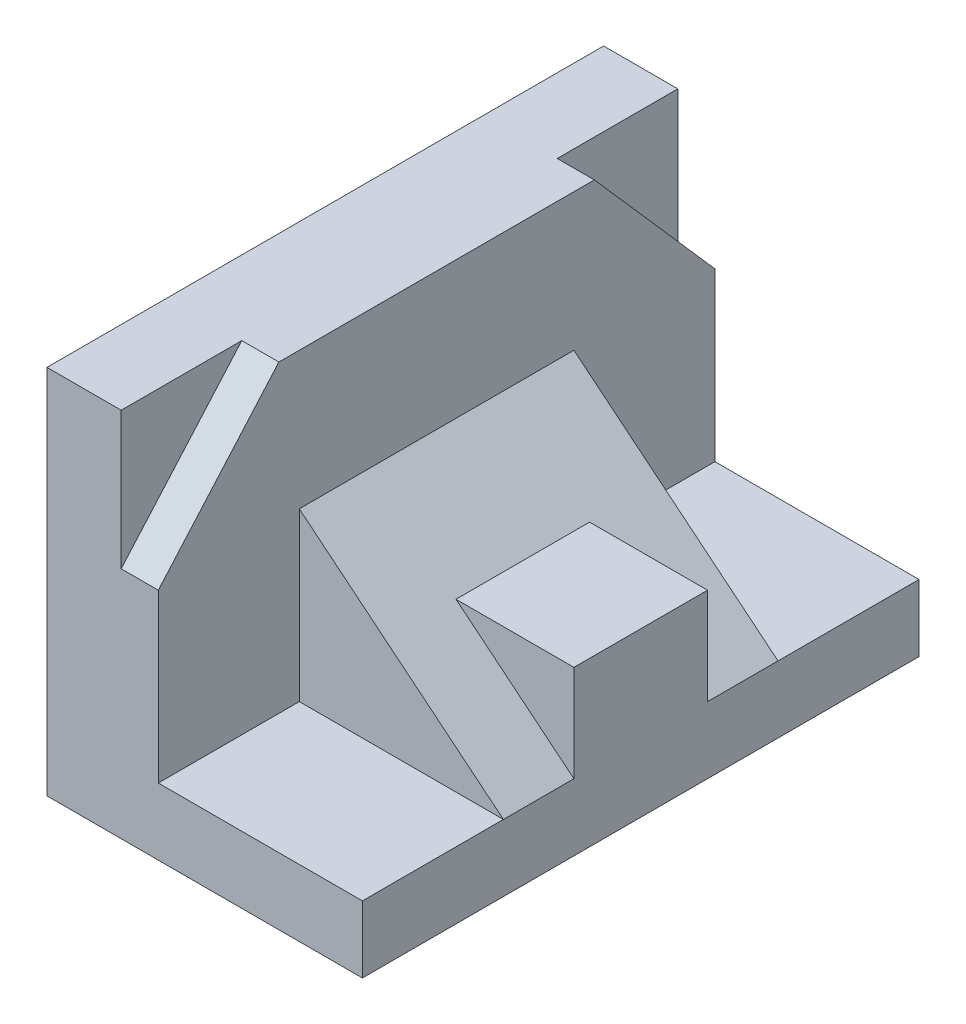
ISO-10303-21;
HEADER;
FILE_DESCRIPTION(('STEP AP214'),'2;1');
FILE_NAME('part.step','',(''),(''),'','','');
FILE_SCHEMA(('AUTOMOTIVE_DESIGN { 1 0 10303 214 1 1 1 1 }'));
ENDSEC;
DATA;
#1=APPLICATION_CONTEXT('core data for automotive mechanical design processes');
#2=APPLICATION_PROTOCOL_DEFINITION('international standard','automotive_design',2000,#1);
#3=PRODUCT_CONTEXT('',#1,'mechanical');
#4=PRODUCT('Part','Part','',(#3));
#5=PRODUCT_RELATED_PRODUCT_CATEGORY('part','',(#4));
#6=PRODUCT_DEFINITION_FORMATION('','',#4);
#7=PRODUCT_DEFINITION_CONTEXT('part definition',#1,'design');
#8=PRODUCT_DEFINITION('design','',#6,#7);
#9=PRODUCT_DEFINITION_SHAPE('','',#8);
#10=(LENGTH_UNIT() NAMED_UNIT(*) SI_UNIT(.MILLI.,.METRE.));
#11=(NAMED_UNIT(*) PLANE_ANGLE_UNIT() SI_UNIT($,.RADIAN.));
#12=(NAMED_UNIT(*) SI_UNIT($,.STERADIAN.) SOLID_ANGLE_UNIT());
#13=UNCERTAINTY_MEASURE_WITH_UNIT(LENGTH_MEASURE(1.E-05),#10,'distance_accuracy_value','');
#14=(GEOMETRIC_REPRESENTATION_CONTEXT(3) GLOBAL_UNCERTAINTY_ASSIGNED_CONTEXT((#13)) GLOBAL_UNIT_ASSIGNED_CONTEXT((#10,
#11,#12)) REPRESENTATION_CONTEXT('',''));
#15=CARTESIAN_POINT('',(0.,0.,0.));
#16=DIRECTION('',(0.,0.,1.));
#17=DIRECTION('',(1.,0.,0.));
#18=AXIS2_PLACEMENT_3D('',#15,#16,#17);
#19=CARTESIAN_POINT('',(-19.0655605518411,0.,0.));
#20=DIRECTION('',(1.,0.,0.));
#21=DIRECTION('',(0.,0.,-1.));
#22=AXIS2_PLACEMENT_3D('',#19,#20,#21);
#23=PLANE('',#22);
#24=DIRECTION('',(0.,-1.,0.));
#25=VECTOR('',#24,1.);
#26=CARTESIAN_POINT('',(-19.065560551841,100.,29.6907665505226));
#27=LINE('',#26,#25);
#28=CARTESIAN_POINT('',(-19.065560551841,100.,29.6907665505226));
#29=VERTEX_POINT('',#28);
#30=CARTESIAN_POINT('',(-19.065560551841,63.,29.6907665505226));
#31=VERTEX_POINT('',#30);
#32=EDGE_CURVE('E173',#29,#31,#27,.T.);
#33=ORIENTED_EDGE('',*,*,#32,.T.);
#34=DIRECTION('',(0.,-0.751317435494103,0.659940990636712));
#35=VECTOR('',#34,1.);
#36=CARTESIAN_POINT('',(-19.0655605518411,100.,-2.80923344947735));
#37=LINE('',#36,#35);
#38=CARTESIAN_POINT('',(-19.0655605518411,100.,-2.80923344947735));
#39=VERTEX_POINT('',#38);
#40=EDGE_CURVE('E186',#39,#31,#37,.T.);
#41=ORIENTED_EDGE('',*,*,#40,.F.);
#42=DIRECTION('',(0.,0.,1.));
#43=VECTOR('',#42,1.);
#44=CARTESIAN_POINT('',(-19.065560551841,100.,29.6907665505226));
#45=LINE('',#44,#43);
#46=EDGE_CURVE('E196',#39,#29,#45,.T.);
#47=ORIENTED_EDGE('',*,*,#46,.T.);
#48=EDGE_LOOP('',(#33,#41,#47));
#49=FACE_BOUND('',#48,.T.);
#50=ADVANCED_FACE('F41',(#49),#23,.T.);
#51=CARTESIAN_POINT('',(-19.0655605518411,100.,-120.309233449477));
#52=VERTEX_POINT('',#51);
#53=CARTESIAN_POINT('',(-19.0655605518411,100.,-87.8092334494774));
#54=VERTEX_POINT('',#53);
#55=EDGE_CURVE('E57',#52,#54,#45,.T.);
#56=ORIENTED_EDGE('',*,*,#55,.T.);
#57=DIRECTION('',(0.,0.751317435494103,0.659940990636712));
#58=VECTOR('',#57,1.);
#59=CARTESIAN_POINT('',(-19.0655605518411,100.,-87.8092334494774));
#60=LINE('',#59,#58);
#61=CARTESIAN_POINT('',(-19.0655605518411,63.,-120.309233449477));
#62=VERTEX_POINT('',#61);
#63=EDGE_CURVE('E170',#62,#54,#60,.T.);
#64=ORIENTED_EDGE('',*,*,#63,.F.);
#65=DIRECTION('',(0.,1.,0.));
#66=VECTOR('',#65,1.);
#67=CARTESIAN_POINT('',(-19.0655605518411,100.,-120.309233449477));
#68=LINE('',#67,#66);
#69=EDGE_CURVE('E61',#62,#52,#68,.T.);
#70=ORIENTED_EDGE('',*,*,#69,.T.);
#71=EDGE_LOOP('',(#56,#64,#70));
#72=FACE_BOUND('',#71,.T.);
#73=ADVANCED_FACE('F383',(#72),#23,.T.);
#74=CARTESIAN_POINT('',(0.,100.,0.));
#75=DIRECTION('',(0.,1.,0.));
#76=DIRECTION('',(0.,0.,1.));
#77=AXIS2_PLACEMENT_3D('',#74,#75,#76);
#78=PLANE('',#77);
#79=DIRECTION('',(1.,0.,0.));
#80=VECTOR('',#79,1.);
#81=CARTESIAN_POINT('',(-39.0655605518411,100.,29.6907665505226));
#82=LINE('',#81,#80);
#83=CARTESIAN_POINT('',(-39.0655605518411,100.,29.6907665505226));
#84=VERTEX_POINT('',#83);
#85=EDGE_CURVE('E259',#84,#29,#82,.T.);
#86=ORIENTED_EDGE('',*,*,#85,.T.);
#87=ORIENTED_EDGE('',*,*,#46,.F.);
#88=DIRECTION('',(-1.,0.,0.));
#89=VECTOR('',#88,1.);
#90=CARTESIAN_POINT('',(-9.06556055184105,100.,-2.80923344947735));
#91=LINE('',#90,#89);
#92=CARTESIAN_POINT('',(-9.06556055184105,100.,-2.80923344947735));
#93=VERTEX_POINT('',#92);
#94=EDGE_CURVE('E174',#93,#39,#91,.T.);
#95=ORIENTED_EDGE('',*,*,#94,.F.);
#96=DIRECTION('',(0.,0.,1.));
#97=VECTOR('',#96,1.);
#98=CARTESIAN_POINT('',(-9.06556055184105,100.,-2.80923344947735));
#99=LINE('',#98,#97);
#100=CARTESIAN_POINT('',(-9.06556055184108,100.,-87.8092334494774));
#101=VERTEX_POINT('',#100);
#102=EDGE_CURVE('E158',#101,#93,#99,.T.);
#103=ORIENTED_EDGE('',*,*,#102,.F.);
#104=DIRECTION('',(-1.,0.,0.));
#105=VECTOR('',#104,1.);
#106=CARTESIAN_POINT('',(-9.06556055184108,100.,-87.8092334494774));
#107=LINE('',#106,#105);
#108=EDGE_CURVE('E168',#101,#54,#107,.T.);
#109=ORIENTED_EDGE('',*,*,#108,.T.);
#110=ORIENTED_EDGE('',*,*,#55,.F.);
#111=DIRECTION('',(-1.,0.,0.));
#112=VECTOR('',#111,1.);
#113=CARTESIAN_POINT('',(-39.0655605518411,100.,-120.309233449477));
#114=LINE('',#113,#112);
#115=CARTESIAN_POINT('',(-39.0655605518411,100.,-120.309233449477));
#116=VERTEX_POINT('',#115);
#117=EDGE_CURVE('E267',#52,#116,#114,.T.);
#118=ORIENTED_EDGE('',*,*,#117,.T.);
#119=DIRECTION('',(0.,0.,1.));
#120=VECTOR('',#119,1.);
#121=CARTESIAN_POINT('',(-39.0655605518411,100.,-120.309233449477));
#122=LINE('',#121,#120);
#123=EDGE_CURVE('E263',#116,#84,#122,.T.);
#124=ORIENTED_EDGE('',*,*,#123,.T.);
#125=EDGE_LOOP('',(#86,#87,#95,#103,#109,#110,#118,#124));
#126=FACE_BOUND('',#125,.T.);
#127=ADVANCED_FACE('F177',(#126),#78,.T.);
#128=CARTESIAN_POINT('',(45.934439448159,18.,-82.3092334494773));
#129=DIRECTION('',(-0.633237790257262,-0.773957299203321,0.));
#130=DIRECTION('',(0.773957299203321,-0.633237790257263,0.));
#131=AXIS2_PLACEMENT_3D('',#128,#129,#130);
#132=PLANE('',#131);
#133=DIRECTION('',(0.773957299203321,-0.633237790257263,0.));
#134=VECTOR('',#133,1.);
#135=CARTESIAN_POINT('',(45.934439448159,18.,-27.3092334494773));
#136=LINE('',#135,#134);
#137=CARTESIAN_POINT('',(14.1566616703812,44.,-27.3092334494773));
#138=VERTEX_POINT('',#137);
#139=CARTESIAN_POINT('',(45.934439448159,18.,-27.3092334494773));
#140=VERTEX_POINT('',#139);
#141=EDGE_CURVE('E12',#138,#140,#136,.T.);
#142=ORIENTED_EDGE('',*,*,#141,.F.);
#143=DIRECTION('',(0.,0.,-1.));
#144=VECTOR('',#143,1.);
#145=CARTESIAN_POINT('',(14.1566616703812,44.,-82.3092334494773));
#146=LINE('',#145,#144);
#147=CARTESIAN_POINT('',(14.1566616703812,44.,-63.3092334494773));
#148=VERTEX_POINT('',#147);
#149=EDGE_CURVE('E314',#138,#148,#146,.T.);
#150=ORIENTED_EDGE('',*,*,#149,.T.);
#151=DIRECTION('',(-0.773957299203321,0.633237790257263,0.));
#152=VECTOR('',#151,1.);
#153=CARTESIAN_POINT('',(45.934439448159,18.,-63.3092334494773));
#154=LINE('',#153,#152);
#155=CARTESIAN_POINT('',(45.934439448159,18.,-63.3092334494773));
#156=VERTEX_POINT('',#155);
#157=EDGE_CURVE('E50',#156,#148,#154,.T.);
#158=ORIENTED_EDGE('',*,*,#157,.F.);
#159=DIRECTION('',(0.,0.,1.));
#160=VECTOR('',#159,1.);
#161=CARTESIAN_POINT('',(45.934439448159,18.,-82.3092334494773));
#162=LINE('',#161,#160);
#163=CARTESIAN_POINT('',(45.934439448159,18.,-82.3092334494773));
#164=VERTEX_POINT('',#163);
#165=EDGE_CURVE('E232',#164,#156,#162,.T.);
#166=ORIENTED_EDGE('',*,*,#165,.F.);
#167=DIRECTION('',(0.773957299203321,-0.633237790257262,0.));
#168=VECTOR('',#167,1.);
#169=CARTESIAN_POINT('',(45.934439448159,18.,-82.3092334494773));
#170=LINE('',#169,#168);
#171=CARTESIAN_POINT('',(-9.06556055184108,63.,-82.3092334494773));
#172=VERTEX_POINT('',#171);
#173=EDGE_CURVE('E224',#172,#164,#170,.T.);
#174=ORIENTED_EDGE('',*,*,#173,.F.);
#175=DIRECTION('',(0.,0.,1.));
#176=VECTOR('',#175,1.);
#177=CARTESIAN_POINT('',(-9.06556055184108,63.,-82.3092334494773));
#178=LINE('',#177,#176);
#179=CARTESIAN_POINT('',(-9.06556055184105,63.,-8.30923344947734));
#180=VERTEX_POINT('',#179);
#181=EDGE_CURVE('E237',#172,#180,#178,.T.);
#182=ORIENTED_EDGE('',*,*,#181,.T.);
#183=DIRECTION('',(0.773957299203321,-0.633237790257262,0.));
#184=VECTOR('',#183,1.);
#185=CARTESIAN_POINT('',(45.934439448159,18.,-8.30923344947734));
#186=LINE('',#185,#184);
#187=CARTESIAN_POINT('',(45.934439448159,18.,-8.30923344947734));
#188=VERTEX_POINT('',#187);
#189=EDGE_CURVE('E211',#180,#188,#186,.T.);
#190=ORIENTED_EDGE('',*,*,#189,.T.);
#191=EDGE_CURVE('E228',#140,#188,#162,.T.);
#192=ORIENTED_EDGE('',*,*,#191,.F.);
#193=EDGE_LOOP('',(#142,#150,#158,#166,#174,#182,#190,#192));
#194=FACE_BOUND('',#193,.T.);
#195=ADVANCED_FACE('F325',(#194),#132,.F.);
#196=CARTESIAN_POINT('',(0.,18.,0.));
#197=DIRECTION('',(0.,1.,0.));
#198=DIRECTION('',(0.,0.,1.));
#199=AXIS2_PLACEMENT_3D('',#196,#197,#198);
#200=PLANE('',#199);
#201=DIRECTION('',(0.,0.,-1.));
#202=VECTOR('',#201,1.);
#203=CARTESIAN_POINT('',(45.9344394481589,18.,-120.309233449477));
#204=LINE('',#203,#202);
#205=CARTESIAN_POINT('',(45.934439448159,18.,29.6907665505227));
#206=VERTEX_POINT('',#205);
#207=EDGE_CURVE('E279',#206,#188,#204,.T.);
#208=ORIENTED_EDGE('',*,*,#207,.T.);
#209=DIRECTION('',(1.,0.,0.));
#210=VECTOR('',#209,1.);
#211=CARTESIAN_POINT('',(-9.06556055184106,18.,-8.30923344947734));
#212=LINE('',#211,#210);
#213=CARTESIAN_POINT('',(-9.06556055184106,18.,-8.30923344947734));
#214=VERTEX_POINT('',#213);
#215=EDGE_CURVE('E236',#214,#188,#212,.T.);
#216=ORIENTED_EDGE('',*,*,#215,.F.);
#217=DIRECTION('',(0.,0.,-1.));
#218=VECTOR('',#217,1.);
#219=CARTESIAN_POINT('',(-9.06556055184109,18.,-120.309233449477));
#220=LINE('',#219,#218);
#221=CARTESIAN_POINT('',(-9.06556055184107,18.,29.6907665505227));
#222=VERTEX_POINT('',#221);
#223=EDGE_CURVE('E254',#222,#214,#220,.T.);
#224=ORIENTED_EDGE('',*,*,#223,.F.);
#225=DIRECTION('',(1.,0.,0.));
#226=VECTOR('',#225,1.);
#227=CARTESIAN_POINT('',(-39.065560551841,18.,29.6907665505227));
#228=LINE('',#227,#226);
#229=EDGE_CURVE('E274',#222,#206,#228,.T.);
#230=ORIENTED_EDGE('',*,*,#229,.T.);
#231=EDGE_LOOP('',(#208,#216,#224,#230));
#232=FACE_BOUND('',#231,.T.);
#233=ADVANCED_FACE('F372',(#232),#200,.T.);
#234=CARTESIAN_POINT('',(-9.06556055184108,18.,-82.3092334494773));
#235=VERTEX_POINT('',#234);
#236=CARTESIAN_POINT('',(-9.06556055184109,18.,-120.309233449477));
#237=VERTEX_POINT('',#236);
#238=EDGE_CURVE('E258',#235,#237,#220,.T.);
#239=ORIENTED_EDGE('',*,*,#238,.F.);
#240=DIRECTION('',(-1.,0.,0.));
#241=VECTOR('',#240,1.);
#242=CARTESIAN_POINT('',(-9.06556055184108,18.,-82.3092334494773));
#243=LINE('',#242,#241);
#244=EDGE_CURVE('E241',#164,#235,#243,.T.);
#245=ORIENTED_EDGE('',*,*,#244,.F.);
#246=CARTESIAN_POINT('',(45.9344394481589,18.,-120.309233449477));
#247=VERTEX_POINT('',#246);
#248=EDGE_CURVE('E277',#164,#247,#204,.T.);
#249=ORIENTED_EDGE('',*,*,#248,.T.);
#250=DIRECTION('',(-1.,0.,0.));
#251=VECTOR('',#250,1.);
#252=CARTESIAN_POINT('',(-39.0655605518411,18.,-120.309233449477));
#253=LINE('',#252,#251);
#254=EDGE_CURVE('E283',#247,#237,#253,.T.);
#255=ORIENTED_EDGE('',*,*,#254,.T.);
#256=EDGE_LOOP('',(#239,#245,#249,#255));
#257=FACE_BOUND('',#256,.T.);
#258=ADVANCED_FACE('F370',(#257),#200,.T.);
#259=CARTESIAN_POINT('',(-9.06556055184109,352.970585407784,-120.309233449477));
#260=DIRECTION('',(-1.,0.,0.));
#261=DIRECTION('',(0.,0.,1.));
#262=AXIS2_PLACEMENT_3D('',#259,#260,#261);
#263=PLANE('',#262);
#264=DIRECTION('',(0.,-1.,0.));
#265=VECTOR('',#264,1.);
#266=CARTESIAN_POINT('',(-9.06556055184106,63.,-8.30923344947734));
#267=LINE('',#266,#265);
#268=EDGE_CURVE('E250',#180,#214,#267,.T.);
#269=ORIENTED_EDGE('',*,*,#268,.F.);
#270=ORIENTED_EDGE('',*,*,#181,.F.);
#271=DIRECTION('',(0.,-1.,0.));
#272=VECTOR('',#271,1.);
#273=CARTESIAN_POINT('',(-9.06556055184108,63.,-82.3092334494773));
#274=LINE('',#273,#272);
#275=EDGE_CURVE('E240',#172,#235,#274,.T.);
#276=ORIENTED_EDGE('',*,*,#275,.T.);
#277=ORIENTED_EDGE('',*,*,#238,.T.);
#278=DIRECTION('',(0.,-1.,0.));
#279=VECTOR('',#278,1.);
#280=CARTESIAN_POINT('',(-9.06556055184109,352.970585407784,-120.309233449477));
#281=LINE('',#280,#279);
#282=CARTESIAN_POINT('',(-9.06556055184109,63.,-120.309233449477));
#283=VERTEX_POINT('',#282);
#284=EDGE_CURVE('E161',#283,#237,#281,.T.);
#285=ORIENTED_EDGE('',*,*,#284,.F.);
#286=DIRECTION('',(0.,0.751317435494103,0.659940990636712));
#287=VECTOR('',#286,1.);
#288=CARTESIAN_POINT('',(-9.06556055184108,100.,-87.8092334494774));
#289=LINE('',#288,#287);
#290=EDGE_CURVE('E152',#283,#101,#289,.T.);
#291=ORIENTED_EDGE('',*,*,#290,.T.);
#292=ORIENTED_EDGE('',*,*,#102,.T.);
#293=DIRECTION('',(0.,-0.751317435494103,0.659940990636712));
#294=VECTOR('',#293,1.);
#295=CARTESIAN_POINT('',(-9.06556055184105,100.,-2.80923344947735));
#296=LINE('',#295,#294);
#297=CARTESIAN_POINT('',(-9.06556055184104,63.,29.6907665505226));
#298=VERTEX_POINT('',#297);
#299=EDGE_CURVE('E165',#93,#298,#296,.T.);
#300=ORIENTED_EDGE('',*,*,#299,.T.);
#301=DIRECTION('',(0.,-1.,0.));
#302=VECTOR('',#301,1.);
#303=CARTESIAN_POINT('',(-9.06556055184104,352.970585407784,29.6907665505226));
#304=LINE('',#303,#302);
#305=EDGE_CURVE('E253',#298,#222,#304,.T.);
#306=ORIENTED_EDGE('',*,*,#305,.T.);
#307=ORIENTED_EDGE('',*,*,#223,.T.);
#308=EDGE_LOOP('',(#269,#270,#276,#277,#285,#291,#292,#300,#306,#307));
#309=FACE_BOUND('',#308,.T.);
#310=ADVANCED_FACE('F155',(#309),#263,.F.);
#311=CARTESIAN_POINT('',(-39.0655605518411,18.,-120.309233449477));
#312=DIRECTION('',(1.,0.,0.));
#313=DIRECTION('',(0.,0.,-1.));
#314=AXIS2_PLACEMENT_3D('',#311,#312,#313);
#315=PLANE('',#314);
#316=DIRECTION('',(0.,0.,1.));
#317=VECTOR('',#316,1.);
#318=CARTESIAN_POINT('',(-39.0655605518411,0.,-120.309233449477));
#319=LINE('',#318,#317);
#320=CARTESIAN_POINT('',(-39.0655605518411,0.,-120.309233449477));
#321=VERTEX_POINT('',#320);
#322=CARTESIAN_POINT('',(-39.065560551841,0.,29.6907665505227));
#323=VERTEX_POINT('',#322);
#324=EDGE_CURVE('E262',#321,#323,#319,.T.);
#325=ORIENTED_EDGE('',*,*,#324,.T.);
#326=DIRECTION('',(0.,-1.,0.));
#327=VECTOR('',#326,1.);
#328=CARTESIAN_POINT('',(-39.065560551841,18.,29.6907665505227));
#329=LINE('',#328,#327);
#330=EDGE_CURVE('E310',#84,#323,#329,.T.);
#331=ORIENTED_EDGE('',*,*,#330,.F.);
#332=ORIENTED_EDGE('',*,*,#123,.F.);
#333=DIRECTION('',(0.,-1.,0.));
#334=VECTOR('',#333,1.);
#335=CARTESIAN_POINT('',(-39.0655605518411,18.,-120.309233449477));
#336=LINE('',#335,#334);
#337=EDGE_CURVE('E287',#116,#321,#336,.T.);
#338=ORIENTED_EDGE('',*,*,#337,.T.);
#339=EDGE_LOOP('',(#325,#331,#332,#338));
#340=FACE_BOUND('',#339,.T.);
#341=ADVANCED_FACE('F43',(#340),#315,.F.);
#342=CARTESIAN_POINT('',(-39.065560551841,18.,29.6907665505227));
#343=DIRECTION('',(0.,0.,-1.));
#344=DIRECTION('',(-1.,0.,0.));
#345=AXIS2_PLACEMENT_3D('',#342,#343,#344);
#346=PLANE('',#345);
#347=ORIENTED_EDGE('',*,*,#305,.F.);
#348=DIRECTION('',(1.,0.,0.));
#349=VECTOR('',#348,1.);
#350=CARTESIAN_POINT('',(-19.065560551841,63.,29.6907665505226));
#351=LINE('',#350,#349);
#352=EDGE_CURVE('E199',#31,#298,#351,.T.);
#353=ORIENTED_EDGE('',*,*,#352,.F.);
#354=ORIENTED_EDGE('',*,*,#32,.F.);
#355=ORIENTED_EDGE('',*,*,#85,.F.);
#356=ORIENTED_EDGE('',*,*,#330,.T.);
#357=DIRECTION('',(1.,0.,0.));
#358=VECTOR('',#357,1.);
#359=CARTESIAN_POINT('',(-39.065560551841,0.,29.6907665505227));
#360=LINE('',#359,#358);
#361=CARTESIAN_POINT('',(45.934439448159,0.,29.6907665505227));
#362=VERTEX_POINT('',#361);
#363=EDGE_CURVE('E291',#323,#362,#360,.T.);
#364=ORIENTED_EDGE('',*,*,#363,.T.);
#365=DIRECTION('',(0.,-1.,0.));
#366=VECTOR('',#365,1.);
#367=CARTESIAN_POINT('',(45.934439448159,18.,29.6907665505227));
#368=LINE('',#367,#366);
#369=EDGE_CURVE('E306',#206,#362,#368,.T.);
#370=ORIENTED_EDGE('',*,*,#369,.F.);
#371=ORIENTED_EDGE('',*,*,#229,.F.);
#372=EDGE_LOOP('',(#347,#353,#354,#355,#356,#364,#370,#371));
#373=FACE_BOUND('',#372,.T.);
#374=ADVANCED_FACE('F347',(#373),#346,.F.);
#375=CARTESIAN_POINT('',(45.9344394481589,18.,-120.309233449477));
#376=DIRECTION('',(-1.,0.,0.));
#377=DIRECTION('',(0.,0.,1.));
#378=AXIS2_PLACEMENT_3D('',#375,#376,#377);
#379=PLANE('',#378);
#380=ORIENTED_EDGE('',*,*,#248,.F.);
#381=ORIENTED_EDGE('',*,*,#165,.T.);
#382=DIRECTION('',(0.,-1.,0.));
#383=VECTOR('',#382,1.);
#384=CARTESIAN_POINT('',(45.934439448159,180.309262807153,-63.3092334494773));
#385=LINE('',#384,#383);
#386=CARTESIAN_POINT('',(45.934439448159,44.,-63.3092334494773));
#387=VERTEX_POINT('',#386);
#388=EDGE_CURVE('E218',#387,#156,#385,.T.);
#389=ORIENTED_EDGE('',*,*,#388,.F.);
#390=DIRECTION('',(0.,0.,-1.));
#391=VECTOR('',#390,1.);
#392=CARTESIAN_POINT('',(45.934439448159,44.,-63.3092334494773));
#393=LINE('',#392,#391);
#394=CARTESIAN_POINT('',(45.934439448159,44.,-27.3092334494773));
#395=VERTEX_POINT('',#394);
#396=EDGE_CURVE('E207',#395,#387,#393,.T.);
#397=ORIENTED_EDGE('',*,*,#396,.F.);
#398=DIRECTION('',(0.,-1.,0.));
#399=VECTOR('',#398,1.);
#400=CARTESIAN_POINT('',(45.934439448159,180.309262807153,-27.3092334494773));
#401=LINE('',#400,#399);
#402=EDGE_CURVE('E203',#395,#140,#401,.T.);
#403=ORIENTED_EDGE('',*,*,#402,.T.);
#404=ORIENTED_EDGE('',*,*,#191,.T.);
#405=ORIENTED_EDGE('',*,*,#207,.F.);
#406=ORIENTED_EDGE('',*,*,#369,.T.);
#407=DIRECTION('',(0.,0.,-1.));
#408=VECTOR('',#407,1.);
#409=CARTESIAN_POINT('',(45.9344394481589,0.,-120.309233449477));
#410=LINE('',#409,#408);
#411=CARTESIAN_POINT('',(45.9344394481589,0.,-120.309233449477));
#412=VERTEX_POINT('',#411);
#413=EDGE_CURVE('E294',#362,#412,#410,.T.);
#414=ORIENTED_EDGE('',*,*,#413,.T.);
#415=DIRECTION('',(0.,-1.,0.));
#416=VECTOR('',#415,1.);
#417=CARTESIAN_POINT('',(45.9344394481589,18.,-120.309233449477));
#418=LINE('',#417,#416);
#419=EDGE_CURVE('E302',#247,#412,#418,.T.);
#420=ORIENTED_EDGE('',*,*,#419,.F.);
#421=EDGE_LOOP('',(#380,#381,#389,#397,#403,#404,#405,#406,#414,#420));
#422=FACE_BOUND('',#421,.T.);
#423=ADVANCED_FACE('F336',(#422),#379,.F.);
#424=CARTESIAN_POINT('',(-39.0655605518411,18.,-120.309233449477));
#425=DIRECTION('',(0.,0.,1.));
#426=DIRECTION('',(1.,0.,0.));
#427=AXIS2_PLACEMENT_3D('',#424,#425,#426);
#428=PLANE('',#427);
#429=ORIENTED_EDGE('',*,*,#69,.F.);
#430=DIRECTION('',(1.,0.,0.));
#431=VECTOR('',#430,1.);
#432=CARTESIAN_POINT('',(-19.0655605518411,63.,-120.309233449477));
#433=LINE('',#432,#431);
#434=EDGE_CURVE('E200',#62,#283,#433,.T.);
#435=ORIENTED_EDGE('',*,*,#434,.T.);
#436=ORIENTED_EDGE('',*,*,#284,.T.);
#437=ORIENTED_EDGE('',*,*,#254,.F.);
#438=ORIENTED_EDGE('',*,*,#419,.T.);
#439=DIRECTION('',(-1.,0.,0.));
#440=VECTOR('',#439,1.);
#441=CARTESIAN_POINT('',(-39.0655605518411,0.,-120.309233449477));
#442=LINE('',#441,#440);
#443=EDGE_CURVE('E278',#412,#321,#442,.T.);
#444=ORIENTED_EDGE('',*,*,#443,.T.);
#445=ORIENTED_EDGE('',*,*,#337,.F.);
#446=ORIENTED_EDGE('',*,*,#117,.F.);
#447=EDGE_LOOP('',(#429,#435,#436,#437,#438,#444,#445,#446));
#448=FACE_BOUND('',#447,.T.);
#449=ADVANCED_FACE('F361',(#448),#428,.F.);
#450=CARTESIAN_POINT('',(0.,0.,0.));
#451=DIRECTION('',(0.,1.,0.));
#452=DIRECTION('',(0.,0.,1.));
#453=AXIS2_PLACEMENT_3D('',#450,#451,#452);
#454=PLANE('',#453);
#455=ORIENTED_EDGE('',*,*,#324,.F.);
#456=ORIENTED_EDGE('',*,*,#443,.F.);
#457=ORIENTED_EDGE('',*,*,#413,.F.);
#458=ORIENTED_EDGE('',*,*,#363,.F.);
#459=EDGE_LOOP('',(#455,#456,#457,#458));
#460=FACE_BOUND('',#459,.T.);
#461=ADVANCED_FACE('F359',(#460),#454,.F.);
#462=CARTESIAN_POINT('',(-9.06556055184106,63.,-8.30923344947734));
#463=DIRECTION('',(0.,0.,-1.));
#464=DIRECTION('',(-1.,0.,0.));
#465=AXIS2_PLACEMENT_3D('',#462,#463,#464);
#466=PLANE('',#465);
#467=ORIENTED_EDGE('',*,*,#215,.T.);
#468=ORIENTED_EDGE('',*,*,#189,.F.);
#469=ORIENTED_EDGE('',*,*,#268,.T.);
#470=EDGE_LOOP('',(#467,#468,#469));
#471=FACE_BOUND('',#470,.T.);
#472=ADVANCED_FACE('F403',(#471),#466,.F.);
#473=CARTESIAN_POINT('',(-9.06556055184108,63.,-82.3092334494773));
#474=DIRECTION('',(0.,0.,1.));
#475=DIRECTION('',(1.,0.,0.));
#476=AXIS2_PLACEMENT_3D('',#473,#474,#475);
#477=PLANE('',#476);
#478=ORIENTED_EDGE('',*,*,#275,.F.);
#479=ORIENTED_EDGE('',*,*,#173,.T.);
#480=ORIENTED_EDGE('',*,*,#244,.T.);
#481=EDGE_LOOP('',(#478,#479,#480));
#482=FACE_BOUND('',#481,.T.);
#483=ADVANCED_FACE('F396',(#482),#477,.F.);
#484=CARTESIAN_POINT('',(-39.065560551841,180.309262807153,-27.3092334494773));
#485=DIRECTION('',(0.,0.,-1.));
#486=DIRECTION('',(-1.,0.,0.));
#487=AXIS2_PLACEMENT_3D('',#484,#485,#486);
#488=PLANE('',#487);
#489=DIRECTION('',(1.,0.,0.));
#490=VECTOR('',#489,1.);
#491=CARTESIAN_POINT('',(-39.065560551841,44.,-27.3092334494773));
#492=LINE('',#491,#490);
#493=EDGE_CURVE('E212',#138,#395,#492,.T.);
#494=ORIENTED_EDGE('',*,*,#493,.F.);
#495=ORIENTED_EDGE('',*,*,#141,.T.);
#496=ORIENTED_EDGE('',*,*,#402,.F.);
#497=EDGE_LOOP('',(#494,#495,#496));
#498=FACE_BOUND('',#497,.T.);
#499=ADVANCED_FACE('F333',(#498),#488,.F.);
#500=CARTESIAN_POINT('',(-39.0655605518411,180.309262807153,-63.3092334494773));
#501=DIRECTION('',(0.,0.,1.));
#502=DIRECTION('',(1.,0.,0.));
#503=AXIS2_PLACEMENT_3D('',#500,#501,#502);
#504=PLANE('',#503);
#505=ORIENTED_EDGE('',*,*,#388,.T.);
#506=ORIENTED_EDGE('',*,*,#157,.T.);
#507=DIRECTION('',(-1.,0.,0.));
#508=VECTOR('',#507,1.);
#509=CARTESIAN_POINT('',(-39.0655605518411,44.,-63.3092334494773));
#510=LINE('',#509,#508);
#511=EDGE_CURVE('E215',#387,#148,#510,.T.);
#512=ORIENTED_EDGE('',*,*,#511,.F.);
#513=EDGE_LOOP('',(#505,#506,#512));
#514=FACE_BOUND('',#513,.T.);
#515=ADVANCED_FACE('F322',(#514),#504,.F.);
#516=CARTESIAN_POINT('',(0.,44.,0.));
#517=DIRECTION('',(0.,1.,0.));
#518=DIRECTION('',(0.,0.,1.));
#519=AXIS2_PLACEMENT_3D('',#516,#517,#518);
#520=PLANE('',#519);
#521=ORIENTED_EDGE('',*,*,#149,.F.);
#522=ORIENTED_EDGE('',*,*,#493,.T.);
#523=ORIENTED_EDGE('',*,*,#396,.T.);
#524=ORIENTED_EDGE('',*,*,#511,.T.);
#525=EDGE_LOOP('',(#521,#522,#523,#524));
#526=FACE_BOUND('',#525,.T.);
#527=ADVANCED_FACE('F329',(#526),#520,.T.);
#528=CARTESIAN_POINT('',(-9.06556055184105,100.,-2.80923344947735));
#529=DIRECTION('',(0.,-0.659940990636712,-0.751317435494103));
#530=DIRECTION('',(0.,0.751317435494103,-0.659940990636712));
#531=AXIS2_PLACEMENT_3D('',#528,#529,#530);
#532=PLANE('',#531);
#533=ORIENTED_EDGE('',*,*,#40,.T.);
#534=ORIENTED_EDGE('',*,*,#352,.T.);
#535=ORIENTED_EDGE('',*,*,#299,.F.);
#536=ORIENTED_EDGE('',*,*,#94,.T.);
#537=EDGE_LOOP('',(#533,#534,#535,#536));
#538=FACE_BOUND('',#537,.T.);
#539=ADVANCED_FACE('F390',(#538),#532,.F.);
#540=CARTESIAN_POINT('',(-9.06556055184108,100.,-87.8092334494774));
#541=DIRECTION('',(0.,-0.659940990636712,0.751317435494103));
#542=DIRECTION('',(0.,-0.751317435494103,-0.659940990636712));
#543=AXIS2_PLACEMENT_3D('',#540,#541,#542);
#544=PLANE('',#543);
#545=ORIENTED_EDGE('',*,*,#63,.T.);
#546=ORIENTED_EDGE('',*,*,#108,.F.);
#547=ORIENTED_EDGE('',*,*,#290,.F.);
#548=ORIENTED_EDGE('',*,*,#434,.F.);
#549=EDGE_LOOP('',(#545,#546,#547,#548));
#550=FACE_BOUND('',#549,.T.);
#551=ADVANCED_FACE('F169',(#550),#544,.F.);
#552=CLOSED_SHELL('',(#50,#73,#127,#195,#233,#258,#310,#341,#374,#423,#449,#461,#472,#483,#499,
#515,#527,#539,#551));
#553=MANIFOLD_SOLID_BREP('B2',#552);
#554=ADVANCED_BREP_SHAPE_REPRESENTATION('',(#18,#553),#14);
#555=SHAPE_DEFINITION_REPRESENTATION(#9,#554);
ENDSEC;
END-ISO-10303-21;
